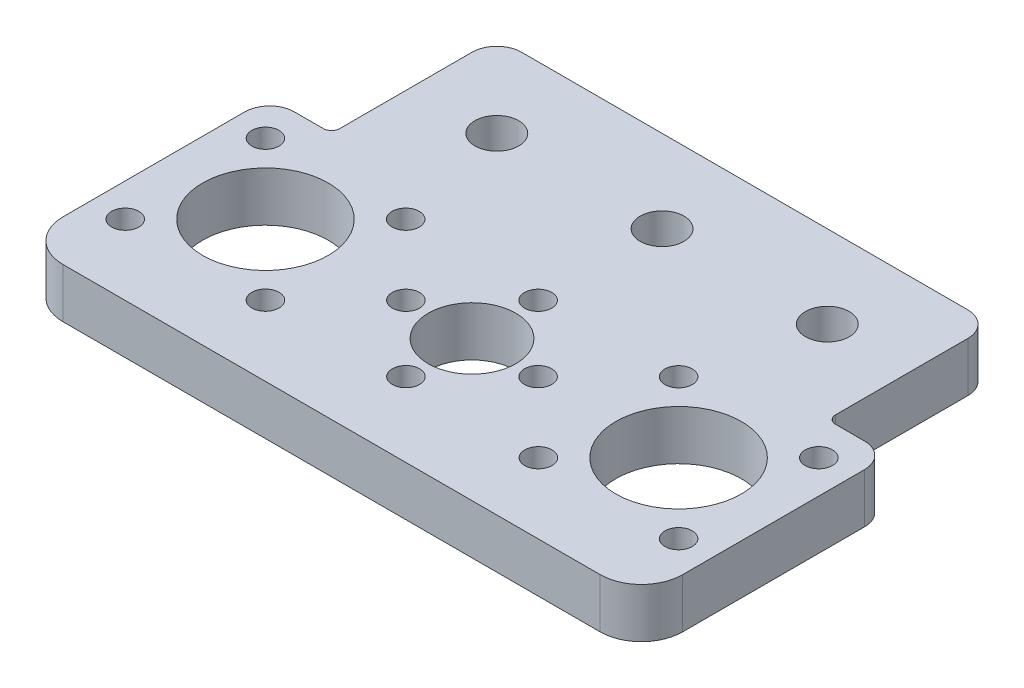
ISO-10303-21;
HEADER;
FILE_DESCRIPTION(('STEP AP214'),'2;1');
FILE_NAME('part.step','',(''),(''),'','','');
FILE_SCHEMA(('AUTOMOTIVE_DESIGN { 1 0 10303 214 1 1 1 1 }'));
ENDSEC;
DATA;
#1=APPLICATION_CONTEXT('core data for automotive mechanical design processes');
#2=APPLICATION_PROTOCOL_DEFINITION('international standard','automotive_design',2000,#1);
#3=PRODUCT_CONTEXT('',#1,'mechanical');
#4=PRODUCT('Part','Part','',(#3));
#5=PRODUCT_RELATED_PRODUCT_CATEGORY('part','',(#4));
#6=PRODUCT_DEFINITION_FORMATION('','',#4);
#7=PRODUCT_DEFINITION_CONTEXT('part definition',#1,'design');
#8=PRODUCT_DEFINITION('design','',#6,#7);
#9=PRODUCT_DEFINITION_SHAPE('','',#8);
#10=(LENGTH_UNIT() NAMED_UNIT(*) SI_UNIT(.MILLI.,.METRE.));
#11=(NAMED_UNIT(*) PLANE_ANGLE_UNIT() SI_UNIT($,.RADIAN.));
#12=(NAMED_UNIT(*) SI_UNIT($,.STERADIAN.) SOLID_ANGLE_UNIT());
#13=UNCERTAINTY_MEASURE_WITH_UNIT(LENGTH_MEASURE(1.E-05),#10,'distance_accuracy_value','');
#14=(GEOMETRIC_REPRESENTATION_CONTEXT(3) GLOBAL_UNCERTAINTY_ASSIGNED_CONTEXT((#13)) GLOBAL_UNIT_ASSIGNED_CONTEXT((#10,
#11,#12)) REPRESENTATION_CONTEXT('',''));
#15=CARTESIAN_POINT('',(0.,0.,0.));
#16=DIRECTION('',(0.,0.,1.));
#17=DIRECTION('',(1.,0.,0.));
#18=AXIS2_PLACEMENT_3D('',#15,#16,#17);
#19=CARTESIAN_POINT('',(0.,6.,17.));
#20=DIRECTION('',(0.,0.,-1.));
#21=DIRECTION('',(-1.,0.,0.));
#22=AXIS2_PLACEMENT_3D('',#19,#20,#21);
#23=PLANE('',#22);
#24=DIRECTION('',(1.,0.,0.));
#25=VECTOR('',#24,1.);
#26=CARTESIAN_POINT('',(0.,0.,17.));
#27=LINE('',#26,#25);
#28=CARTESIAN_POINT('',(-32.5,0.,17.));
#29=VERTEX_POINT('',#28);
#30=CARTESIAN_POINT('',(32.5,0.,17.));
#31=VERTEX_POINT('',#30);
#32=EDGE_CURVE('E172',#29,#31,#27,.T.);
#33=ORIENTED_EDGE('',*,*,#32,.T.);
#34=DIRECTION('',(0.,-1.,0.));
#35=VECTOR('',#34,1.);
#36=CARTESIAN_POINT('',(32.5,6.,17.));
#37=LINE('',#36,#35);
#38=CARTESIAN_POINT('',(32.5,6.,17.));
#39=VERTEX_POINT('',#38);
#40=EDGE_CURVE('E152',#39,#31,#37,.T.);
#41=ORIENTED_EDGE('',*,*,#40,.F.);
#42=DIRECTION('',(1.,0.,0.));
#43=VECTOR('',#42,1.);
#44=CARTESIAN_POINT('',(0.,6.,17.));
#45=LINE('',#44,#43);
#46=CARTESIAN_POINT('',(-32.5,6.,17.));
#47=VERTEX_POINT('',#46);
#48=EDGE_CURVE('E159',#47,#39,#45,.T.);
#49=ORIENTED_EDGE('',*,*,#48,.F.);
#50=DIRECTION('',(0.,-1.,0.));
#51=VECTOR('',#50,1.);
#52=CARTESIAN_POINT('',(-32.5,6.,17.));
#53=LINE('',#52,#51);
#54=EDGE_CURVE('E267',#47,#29,#53,.T.);
#55=ORIENTED_EDGE('',*,*,#54,.T.);
#56=EDGE_LOOP('',(#33,#41,#49,#55));
#57=FACE_BOUND('',#56,.T.);
#58=ADVANCED_FACE('F35',(#57),#23,.F.);
#59=CARTESIAN_POINT('',(32.5,6.,12.));
#60=DIRECTION('',(0.,-1.,0.));
#61=DIRECTION('',(0.,0.,-1.));
#62=AXIS2_PLACEMENT_3D('',#59,#60,#61);
#63=CYLINDRICAL_SURFACE('',#62,5.);
#64=CARTESIAN_POINT('',(32.5,0.,12.));
#65=DIRECTION('',(0.,1.,0.));
#66=DIRECTION('',(0.,0.,1.));
#67=AXIS2_PLACEMENT_3D('',#64,#65,#66);
#68=CIRCLE('',#67,5.);
#69=CARTESIAN_POINT('',(37.5,0.,12.));
#70=VERTEX_POINT('',#69);
#71=EDGE_CURVE('E276',#31,#70,#68,.T.);
#72=ORIENTED_EDGE('',*,*,#71,.T.);
#73=DIRECTION('',(0.,-1.,0.));
#74=VECTOR('',#73,1.);
#75=CARTESIAN_POINT('',(37.5,6.,12.));
#76=LINE('',#75,#74);
#77=CARTESIAN_POINT('',(37.5,6.,12.));
#78=VERTEX_POINT('',#77);
#79=EDGE_CURVE('E155',#78,#70,#76,.T.);
#80=ORIENTED_EDGE('',*,*,#79,.F.);
#81=CARTESIAN_POINT('',(32.5,6.,12.));
#82=DIRECTION('',(0.,1.,0.));
#83=DIRECTION('',(0.,0.,1.));
#84=AXIS2_PLACEMENT_3D('',#81,#82,#83);
#85=CIRCLE('',#84,5.);
#86=EDGE_CURVE('E147',#39,#78,#85,.T.);
#87=ORIENTED_EDGE('',*,*,#86,.F.);
#88=ORIENTED_EDGE('',*,*,#40,.T.);
#89=EDGE_LOOP('',(#72,#80,#87,#88));
#90=FACE_BOUND('',#89,.T.);
#91=ADVANCED_FACE('F150',(#90),#63,.T.);
#92=CARTESIAN_POINT('',(37.5,6.,0.));
#93=DIRECTION('',(1.,0.,0.));
#94=DIRECTION('',(0.,0.,-1.));
#95=AXIS2_PLACEMENT_3D('',#92,#93,#94);
#96=PLANE('',#95);
#97=DIRECTION('',(0.,0.,1.));
#98=VECTOR('',#97,1.);
#99=CARTESIAN_POINT('',(37.5,0.,0.));
#100=LINE('',#99,#98);
#101=CARTESIAN_POINT('',(37.5,0.,-10.));
#102=VERTEX_POINT('',#101);
#103=EDGE_CURVE('E279',#102,#70,#100,.T.);
#104=ORIENTED_EDGE('',*,*,#103,.F.);
#105=DIRECTION('',(0.,-1.,0.));
#106=VECTOR('',#105,1.);
#107=CARTESIAN_POINT('',(37.5,6.,-10.));
#108=LINE('',#107,#106);
#109=CARTESIAN_POINT('',(37.5,6.,-10.));
#110=VERTEX_POINT('',#109);
#111=EDGE_CURVE('E215',#102,#110,#108,.F.);
#112=ORIENTED_EDGE('',*,*,#111,.T.);
#113=DIRECTION('',(0.,0.,1.));
#114=VECTOR('',#113,1.);
#115=CARTESIAN_POINT('',(37.5,6.,0.));
#116=LINE('',#115,#114);
#117=EDGE_CURVE('E158',#110,#78,#116,.T.);
#118=ORIENTED_EDGE('',*,*,#117,.T.);
#119=ORIENTED_EDGE('',*,*,#79,.T.);
#120=EDGE_LOOP('',(#104,#112,#118,#119));
#121=FACE_BOUND('',#120,.T.);
#122=ADVANCED_FACE('F389',(#121),#96,.T.);
#123=CARTESIAN_POINT('',(0.,6.,-13.));
#124=DIRECTION('',(0.,0.,-1.));
#125=DIRECTION('',(-1.,0.,0.));
#126=AXIS2_PLACEMENT_3D('',#123,#124,#125);
#127=PLANE('',#126);
#128=DIRECTION('',(1.,0.,0.));
#129=VECTOR('',#128,1.);
#130=CARTESIAN_POINT('',(0.,0.,-13.));
#131=LINE('',#130,#129);
#132=CARTESIAN_POINT('',(31.,0.,-13.));
#133=VERTEX_POINT('',#132);
#134=CARTESIAN_POINT('',(34.5,0.,-13.));
#135=VERTEX_POINT('',#134);
#136=EDGE_CURVE('E287',#133,#135,#131,.T.);
#137=ORIENTED_EDGE('',*,*,#136,.F.);
#138=DIRECTION('',(0.,-1.,0.));
#139=VECTOR('',#138,1.);
#140=CARTESIAN_POINT('',(31.,6.,-13.));
#141=LINE('',#140,#139);
#142=CARTESIAN_POINT('',(31.,6.,-13.));
#143=VERTEX_POINT('',#142);
#144=EDGE_CURVE('E56',#133,#143,#141,.F.);
#145=ORIENTED_EDGE('',*,*,#144,.T.);
#146=DIRECTION('',(1.,0.,0.));
#147=VECTOR('',#146,1.);
#148=CARTESIAN_POINT('',(0.,6.,-13.));
#149=LINE('',#148,#147);
#150=CARTESIAN_POINT('',(34.5,6.,-13.));
#151=VERTEX_POINT('',#150);
#152=EDGE_CURVE('E309',#143,#151,#149,.T.);
#153=ORIENTED_EDGE('',*,*,#152,.T.);
#154=DIRECTION('',(0.,-1.,0.));
#155=VECTOR('',#154,1.);
#156=CARTESIAN_POINT('',(34.5,6.,-13.));
#157=LINE('',#156,#155);
#158=EDGE_CURVE('E212',#151,#135,#157,.T.);
#159=ORIENTED_EDGE('',*,*,#158,.T.);
#160=EDGE_LOOP('',(#137,#145,#153,#159));
#161=FACE_BOUND('',#160,.T.);
#162=ADVANCED_FACE('F394',(#161),#127,.T.);
#163=CARTESIAN_POINT('',(30.,6.,0.));
#164=DIRECTION('',(1.,0.,0.));
#165=DIRECTION('',(0.,0.,-1.));
#166=AXIS2_PLACEMENT_3D('',#163,#164,#165);
#167=PLANE('',#166);
#168=DIRECTION('',(0.,0.,1.));
#169=VECTOR('',#168,1.);
#170=CARTESIAN_POINT('',(30.,6.,0.));
#171=LINE('',#170,#169);
#172=CARTESIAN_POINT('',(30.,6.,-30.));
#173=VERTEX_POINT('',#172);
#174=CARTESIAN_POINT('',(30.,6.,-14.));
#175=VERTEX_POINT('',#174);
#176=EDGE_CURVE('E302',#173,#175,#171,.T.);
#177=ORIENTED_EDGE('',*,*,#176,.T.);
#178=DIRECTION('',(0.,-1.,0.));
#179=VECTOR('',#178,1.);
#180=CARTESIAN_POINT('',(30.,0.,-14.));
#181=LINE('',#180,#179);
#182=CARTESIAN_POINT('',(30.,0.,-14.));
#183=VERTEX_POINT('',#182);
#184=EDGE_CURVE('E222',#175,#183,#181,.T.);
#185=ORIENTED_EDGE('',*,*,#184,.T.);
#186=DIRECTION('',(0.,0.,1.));
#187=VECTOR('',#186,1.);
#188=CARTESIAN_POINT('',(30.,0.,0.));
#189=LINE('',#188,#187);
#190=CARTESIAN_POINT('',(30.,0.,-30.));
#191=VERTEX_POINT('',#190);
#192=EDGE_CURVE('E259',#191,#183,#189,.T.);
#193=ORIENTED_EDGE('',*,*,#192,.F.);
#194=DIRECTION('',(0.,-1.,0.));
#195=VECTOR('',#194,1.);
#196=CARTESIAN_POINT('',(30.,6.,-30.));
#197=LINE('',#196,#195);
#198=EDGE_CURVE('E192',#191,#173,#197,.F.);
#199=ORIENTED_EDGE('',*,*,#198,.T.);
#200=EDGE_LOOP('',(#177,#185,#193,#199));
#201=FACE_BOUND('',#200,.T.);
#202=ADVANCED_FACE('F292',(#201),#167,.T.);
#203=CARTESIAN_POINT('',(0.,6.,-33.));
#204=DIRECTION('',(0.,0.,-1.));
#205=DIRECTION('',(-1.,0.,0.));
#206=AXIS2_PLACEMENT_3D('',#203,#204,#205);
#207=PLANE('',#206);
#208=DIRECTION('',(1.,0.,0.));
#209=VECTOR('',#208,1.);
#210=CARTESIAN_POINT('',(0.,6.,-33.));
#211=LINE('',#210,#209);
#212=CARTESIAN_POINT('',(-27.,6.,-33.));
#213=VERTEX_POINT('',#212);
#214=CARTESIAN_POINT('',(27.,6.,-33.));
#215=VERTEX_POINT('',#214);
#216=EDGE_CURVE('E300',#213,#215,#211,.T.);
#217=ORIENTED_EDGE('',*,*,#216,.T.);
#218=DIRECTION('',(0.,-1.,0.));
#219=VECTOR('',#218,1.);
#220=CARTESIAN_POINT('',(27.,6.,-33.));
#221=LINE('',#220,#219);
#222=CARTESIAN_POINT('',(27.,0.,-33.));
#223=VERTEX_POINT('',#222);
#224=EDGE_CURVE('E175',#215,#223,#221,.T.);
#225=ORIENTED_EDGE('',*,*,#224,.T.);
#226=DIRECTION('',(1.,0.,0.));
#227=VECTOR('',#226,1.);
#228=CARTESIAN_POINT('',(0.,0.,-33.));
#229=LINE('',#228,#227);
#230=CARTESIAN_POINT('',(-27.,0.,-33.));
#231=VERTEX_POINT('',#230);
#232=EDGE_CURVE('E255',#231,#223,#229,.T.);
#233=ORIENTED_EDGE('',*,*,#232,.F.);
#234=DIRECTION('',(0.,-1.,0.));
#235=VECTOR('',#234,1.);
#236=CARTESIAN_POINT('',(-27.,6.,-33.));
#237=LINE('',#236,#235);
#238=EDGE_CURVE('E173',#231,#213,#237,.F.);
#239=ORIENTED_EDGE('',*,*,#238,.T.);
#240=EDGE_LOOP('',(#217,#225,#233,#239));
#241=FACE_BOUND('',#240,.T.);
#242=ADVANCED_FACE('F304',(#241),#207,.T.);
#243=CARTESIAN_POINT('',(-30.,6.,0.));
#244=DIRECTION('',(1.,0.,0.));
#245=DIRECTION('',(0.,0.,-1.));
#246=AXIS2_PLACEMENT_3D('',#243,#244,#245);
#247=PLANE('',#246);
#248=DIRECTION('',(0.,0.,1.));
#249=VECTOR('',#248,1.);
#250=CARTESIAN_POINT('',(-30.,0.,0.));
#251=LINE('',#250,#249);
#252=CARTESIAN_POINT('',(-30.,0.,-30.));
#253=VERTEX_POINT('',#252);
#254=CARTESIAN_POINT('',(-30.,0.,-14.));
#255=VERTEX_POINT('',#254);
#256=EDGE_CURVE('E250',#253,#255,#251,.T.);
#257=ORIENTED_EDGE('',*,*,#256,.T.);
#258=DIRECTION('',(0.,-1.,0.));
#259=VECTOR('',#258,1.);
#260=CARTESIAN_POINT('',(-30.,6.,-14.));
#261=LINE('',#260,#259);
#262=CARTESIAN_POINT('',(-30.,6.,-14.));
#263=VERTEX_POINT('',#262);
#264=EDGE_CURVE('E220',#255,#263,#261,.F.);
#265=ORIENTED_EDGE('',*,*,#264,.T.);
#266=DIRECTION('',(0.,0.,1.));
#267=VECTOR('',#266,1.);
#268=CARTESIAN_POINT('',(-30.,6.,0.));
#269=LINE('',#268,#267);
#270=CARTESIAN_POINT('',(-30.,6.,-30.));
#271=VERTEX_POINT('',#270);
#272=EDGE_CURVE('E234',#271,#263,#269,.T.);
#273=ORIENTED_EDGE('',*,*,#272,.F.);
#274=DIRECTION('',(0.,-1.,0.));
#275=VECTOR('',#274,1.);
#276=CARTESIAN_POINT('',(-30.,0.,-30.));
#277=LINE('',#276,#275);
#278=EDGE_CURVE('E203',#271,#253,#277,.T.);
#279=ORIENTED_EDGE('',*,*,#278,.T.);
#280=EDGE_LOOP('',(#257,#265,#273,#279));
#281=FACE_BOUND('',#280,.T.);
#282=ADVANCED_FACE('F253',(#281),#247,.F.);
#283=CARTESIAN_POINT('',(0.,6.,-13.));
#284=DIRECTION('',(0.,0.,1.));
#285=DIRECTION('',(1.,0.,0.));
#286=AXIS2_PLACEMENT_3D('',#283,#284,#285);
#287=PLANE('',#286);
#288=DIRECTION('',(-1.,0.,0.));
#289=VECTOR('',#288,1.);
#290=CARTESIAN_POINT('',(0.,6.,-13.));
#291=LINE('',#290,#289);
#292=CARTESIAN_POINT('',(-31.,6.,-13.));
#293=VERTEX_POINT('',#292);
#294=CARTESIAN_POINT('',(-34.5,6.,-13.));
#295=VERTEX_POINT('',#294);
#296=EDGE_CURVE('E232',#293,#295,#291,.T.);
#297=ORIENTED_EDGE('',*,*,#296,.F.);
#298=DIRECTION('',(0.,-1.,0.));
#299=VECTOR('',#298,1.);
#300=CARTESIAN_POINT('',(-31.,0.,-13.));
#301=LINE('',#300,#299);
#302=CARTESIAN_POINT('',(-31.,0.,-13.));
#303=VERTEX_POINT('',#302);
#304=EDGE_CURVE('E217',#293,#303,#301,.T.);
#305=ORIENTED_EDGE('',*,*,#304,.T.);
#306=DIRECTION('',(-1.,0.,0.));
#307=VECTOR('',#306,1.);
#308=CARTESIAN_POINT('',(0.,0.,-13.));
#309=LINE('',#308,#307);
#310=CARTESIAN_POINT('',(-34.5,0.,-13.));
#311=VERTEX_POINT('',#310);
#312=EDGE_CURVE('E251',#303,#311,#309,.T.);
#313=ORIENTED_EDGE('',*,*,#312,.T.);
#314=DIRECTION('',(0.,-1.,0.));
#315=VECTOR('',#314,1.);
#316=CARTESIAN_POINT('',(-34.5,6.,-13.));
#317=LINE('',#316,#315);
#318=EDGE_CURVE('E209',#311,#295,#317,.F.);
#319=ORIENTED_EDGE('',*,*,#318,.T.);
#320=EDGE_LOOP('',(#297,#305,#313,#319));
#321=FACE_BOUND('',#320,.T.);
#322=ADVANCED_FACE('F239',(#321),#287,.F.);
#323=CARTESIAN_POINT('',(-37.5,6.,0.));
#324=DIRECTION('',(1.,0.,0.));
#325=DIRECTION('',(0.,0.,-1.));
#326=AXIS2_PLACEMENT_3D('',#323,#324,#325);
#327=PLANE('',#326);
#328=DIRECTION('',(0.,0.,1.));
#329=VECTOR('',#328,1.);
#330=CARTESIAN_POINT('',(-37.5,6.,0.));
#331=LINE('',#330,#329);
#332=CARTESIAN_POINT('',(-37.5,6.,-10.));
#333=VERTEX_POINT('',#332);
#334=CARTESIAN_POINT('',(-37.5,6.,12.));
#335=VERTEX_POINT('',#334);
#336=EDGE_CURVE('E243',#333,#335,#331,.T.);
#337=ORIENTED_EDGE('',*,*,#336,.F.);
#338=DIRECTION('',(0.,-1.,0.));
#339=VECTOR('',#338,1.);
#340=CARTESIAN_POINT('',(-37.5,6.,-10.));
#341=LINE('',#340,#339);
#342=CARTESIAN_POINT('',(-37.5,0.,-10.));
#343=VERTEX_POINT('',#342);
#344=EDGE_CURVE('E206',#333,#343,#341,.T.);
#345=ORIENTED_EDGE('',*,*,#344,.T.);
#346=DIRECTION('',(0.,0.,1.));
#347=VECTOR('',#346,1.);
#348=CARTESIAN_POINT('',(-37.5,0.,0.));
#349=LINE('',#348,#347);
#350=CARTESIAN_POINT('',(-37.5,0.,12.));
#351=VERTEX_POINT('',#350);
#352=EDGE_CURVE('E257',#343,#351,#349,.T.);
#353=ORIENTED_EDGE('',*,*,#352,.T.);
#354=DIRECTION('',(0.,-1.,0.));
#355=VECTOR('',#354,1.);
#356=CARTESIAN_POINT('',(-37.5,6.,12.));
#357=LINE('',#356,#355);
#358=EDGE_CURVE('E177',#335,#351,#357,.T.);
#359=ORIENTED_EDGE('',*,*,#358,.F.);
#360=EDGE_LOOP('',(#337,#345,#353,#359));
#361=FACE_BOUND('',#360,.T.);
#362=ADVANCED_FACE('F380',(#361),#327,.F.);
#363=CARTESIAN_POINT('',(20.,6.,-23.));
#364=DIRECTION('',(0.,-1.,0.));
#365=DIRECTION('',(0.,0.,-1.));
#366=AXIS2_PLACEMENT_3D('',#363,#364,#365);
#367=CYLINDRICAL_SURFACE('',#366,2.65);
#368=CARTESIAN_POINT('',(20.,6.,-23.));
#369=DIRECTION('',(0.,1.,0.));
#370=DIRECTION('',(0.,0.,1.));
#371=AXIS2_PLACEMENT_3D('',#368,#369,#370);
#372=CIRCLE('',#371,2.65);
#373=CARTESIAN_POINT('',(20.,6.,-20.35));
#374=VERTEX_POINT('',#373);
#375=EDGE_CURVE('E169',#374,#374,#372,.T.);
#376=ORIENTED_EDGE('',*,*,#375,.T.);
#377=EDGE_LOOP('',(#376));
#378=FACE_BOUND('',#377,.T.);
#379=CARTESIAN_POINT('',(20.,0.,-23.));
#380=DIRECTION('',(0.,1.,0.));
#381=DIRECTION('',(0.,0.,1.));
#382=AXIS2_PLACEMENT_3D('',#379,#380,#381);
#383=CIRCLE('',#382,2.65);
#384=CARTESIAN_POINT('',(20.,0.,-20.35));
#385=VERTEX_POINT('',#384);
#386=EDGE_CURVE('E277',#385,#385,#383,.T.);
#387=ORIENTED_EDGE('',*,*,#386,.F.);
#388=EDGE_LOOP('',(#387));
#389=FACE_BOUND('',#388,.T.);
#390=ADVANCED_FACE('F370',(#378,#389),#367,.F.);
#391=CARTESIAN_POINT('',(0.,6.,-23.));
#392=DIRECTION('',(0.,-1.,0.));
#393=DIRECTION('',(0.,0.,-1.));
#394=AXIS2_PLACEMENT_3D('',#391,#392,#393);
#395=CYLINDRICAL_SURFACE('',#394,2.65);
#396=CARTESIAN_POINT('',(0.,6.,-23.));
#397=DIRECTION('',(0.,1.,0.));
#398=DIRECTION('',(0.,0.,1.));
#399=AXIS2_PLACEMENT_3D('',#396,#397,#398);
#400=CIRCLE('',#399,2.65);
#401=CARTESIAN_POINT('',(0.,6.,-20.35));
#402=VERTEX_POINT('',#401);
#403=EDGE_CURVE('E483',#402,#402,#400,.T.);
#404=ORIENTED_EDGE('',*,*,#403,.T.);
#405=EDGE_LOOP('',(#404));
#406=FACE_BOUND('',#405,.T.);
#407=CARTESIAN_POINT('',(0.,0.,-23.));
#408=DIRECTION('',(0.,1.,0.));
#409=DIRECTION('',(0.,0.,1.));
#410=AXIS2_PLACEMENT_3D('',#407,#408,#409);
#411=CIRCLE('',#410,2.65);
#412=CARTESIAN_POINT('',(0.,0.,-20.35));
#413=VERTEX_POINT('',#412);
#414=EDGE_CURVE('E282',#413,#413,#411,.T.);
#415=ORIENTED_EDGE('',*,*,#414,.F.);
#416=EDGE_LOOP('',(#415));
#417=FACE_BOUND('',#416,.T.);
#418=ADVANCED_FACE('F367',(#406,#417),#395,.F.);
#419=CARTESIAN_POINT('',(-20.,6.,-23.));
#420=DIRECTION('',(0.,-1.,0.));
#421=DIRECTION('',(0.,0.,-1.));
#422=AXIS2_PLACEMENT_3D('',#419,#420,#421);
#423=CYLINDRICAL_SURFACE('',#422,2.65);
#424=CARTESIAN_POINT('',(-20.,6.,-23.));
#425=DIRECTION('',(0.,1.,0.));
#426=DIRECTION('',(0.,0.,1.));
#427=AXIS2_PLACEMENT_3D('',#424,#425,#426);
#428=CIRCLE('',#427,2.65);
#429=CARTESIAN_POINT('',(-20.,6.,-20.35));
#430=VERTEX_POINT('',#429);
#431=EDGE_CURVE('E480',#430,#430,#428,.T.);
#432=ORIENTED_EDGE('',*,*,#431,.T.);
#433=EDGE_LOOP('',(#432));
#434=FACE_BOUND('',#433,.T.);
#435=CARTESIAN_POINT('',(-20.,0.,-23.));
#436=DIRECTION('',(0.,1.,0.));
#437=DIRECTION('',(0.,0.,1.));
#438=AXIS2_PLACEMENT_3D('',#435,#436,#437);
#439=CIRCLE('',#438,2.65);
#440=CARTESIAN_POINT('',(-20.,0.,-20.35));
#441=VERTEX_POINT('',#440);
#442=EDGE_CURVE('E360',#441,#441,#439,.T.);
#443=ORIENTED_EDGE('',*,*,#442,.F.);
#444=EDGE_LOOP('',(#443));
#445=FACE_BOUND('',#444,.T.);
#446=ADVANCED_FACE('F369',(#434,#445),#423,.F.);
#447=CARTESIAN_POINT('',(-8.,6.,0.));
#448=DIRECTION('',(0.,-1.,0.));
#449=DIRECTION('',(0.,0.,-1.));
#450=AXIS2_PLACEMENT_3D('',#447,#448,#449);
#451=CYLINDRICAL_SURFACE('',#450,1.65);
#452=CARTESIAN_POINT('',(-8.,6.,0.));
#453=DIRECTION('',(0.,1.,0.));
#454=DIRECTION('',(0.,0.,1.));
#455=AXIS2_PLACEMENT_3D('',#452,#453,#454);
#456=CIRCLE('',#455,1.65);
#457=CARTESIAN_POINT('',(-8.,6.,1.65));
#458=VERTEX_POINT('',#457);
#459=EDGE_CURVE('E476',#458,#458,#456,.T.);
#460=ORIENTED_EDGE('',*,*,#459,.T.);
#461=EDGE_LOOP('',(#460));
#462=FACE_BOUND('',#461,.T.);
#463=CARTESIAN_POINT('',(-8.,0.,0.));
#464=DIRECTION('',(0.,1.,0.));
#465=DIRECTION('',(0.,0.,1.));
#466=AXIS2_PLACEMENT_3D('',#463,#464,#465);
#467=CIRCLE('',#466,1.65);
#468=CARTESIAN_POINT('',(-8.,0.,1.65));
#469=VERTEX_POINT('',#468);
#470=EDGE_CURVE('E357',#469,#469,#467,.T.);
#471=ORIENTED_EDGE('',*,*,#470,.F.);
#472=EDGE_LOOP('',(#471));
#473=FACE_BOUND('',#472,.T.);
#474=ADVANCED_FACE('F377',(#462,#473),#451,.F.);
#475=CARTESIAN_POINT('',(0.,6.,8.));
#476=DIRECTION('',(0.,-1.,0.));
#477=DIRECTION('',(0.,0.,-1.));
#478=AXIS2_PLACEMENT_3D('',#475,#476,#477);
#479=CYLINDRICAL_SURFACE('',#478,1.65);
#480=CARTESIAN_POINT('',(0.,6.,8.));
#481=DIRECTION('',(0.,1.,0.));
#482=DIRECTION('',(0.,0.,1.));
#483=AXIS2_PLACEMENT_3D('',#480,#481,#482);
#484=CIRCLE('',#483,1.65);
#485=CARTESIAN_POINT('',(0.,6.,9.65));
#486=VERTEX_POINT('',#485);
#487=EDGE_CURVE('E472',#486,#486,#484,.T.);
#488=ORIENTED_EDGE('',*,*,#487,.T.);
#489=EDGE_LOOP('',(#488));
#490=FACE_BOUND('',#489,.T.);
#491=CARTESIAN_POINT('',(0.,0.,8.));
#492=DIRECTION('',(0.,1.,0.));
#493=DIRECTION('',(0.,0.,1.));
#494=AXIS2_PLACEMENT_3D('',#491,#492,#493);
#495=CIRCLE('',#494,1.65);
#496=CARTESIAN_POINT('',(0.,0.,9.65));
#497=VERTEX_POINT('',#496);
#498=EDGE_CURVE('E354',#497,#497,#495,.T.);
#499=ORIENTED_EDGE('',*,*,#498,.F.);
#500=EDGE_LOOP('',(#499));
#501=FACE_BOUND('',#500,.T.);
#502=ADVANCED_FACE('F568',(#490,#501),#479,.F.);
#503=CARTESIAN_POINT('',(8.,6.,0.));
#504=DIRECTION('',(0.,-1.,0.));
#505=DIRECTION('',(0.,0.,-1.));
#506=AXIS2_PLACEMENT_3D('',#503,#504,#505);
#507=CYLINDRICAL_SURFACE('',#506,1.65);
#508=CARTESIAN_POINT('',(8.,6.,0.));
#509=DIRECTION('',(0.,1.,0.));
#510=DIRECTION('',(0.,0.,1.));
#511=AXIS2_PLACEMENT_3D('',#508,#509,#510);
#512=CIRCLE('',#511,1.65);
#513=CARTESIAN_POINT('',(8.,6.,1.65));
#514=VERTEX_POINT('',#513);
#515=EDGE_CURVE('E468',#514,#514,#512,.T.);
#516=ORIENTED_EDGE('',*,*,#515,.T.);
#517=EDGE_LOOP('',(#516));
#518=FACE_BOUND('',#517,.T.);
#519=CARTESIAN_POINT('',(8.,0.,0.));
#520=DIRECTION('',(0.,1.,0.));
#521=DIRECTION('',(0.,0.,1.));
#522=AXIS2_PLACEMENT_3D('',#519,#520,#521);
#523=CIRCLE('',#522,1.65);
#524=CARTESIAN_POINT('',(8.,0.,1.65));
#525=VERTEX_POINT('',#524);
#526=EDGE_CURVE('E351',#525,#525,#523,.T.);
#527=ORIENTED_EDGE('',*,*,#526,.F.);
#528=EDGE_LOOP('',(#527));
#529=FACE_BOUND('',#528,.T.);
#530=ADVANCED_FACE('F564',(#518,#529),#507,.F.);
#531=CARTESIAN_POINT('',(0.,6.,-8.));
#532=DIRECTION('',(0.,-1.,0.));
#533=DIRECTION('',(0.,0.,-1.));
#534=AXIS2_PLACEMENT_3D('',#531,#532,#533);
#535=CYLINDRICAL_SURFACE('',#534,1.65);
#536=CARTESIAN_POINT('',(0.,6.,-8.));
#537=DIRECTION('',(0.,1.,0.));
#538=DIRECTION('',(0.,0.,1.));
#539=AXIS2_PLACEMENT_3D('',#536,#537,#538);
#540=CIRCLE('',#539,1.65);
#541=CARTESIAN_POINT('',(0.,6.,-6.35));
#542=VERTEX_POINT('',#541);
#543=EDGE_CURVE('E464',#542,#542,#540,.T.);
#544=ORIENTED_EDGE('',*,*,#543,.T.);
#545=EDGE_LOOP('',(#544));
#546=FACE_BOUND('',#545,.T.);
#547=CARTESIAN_POINT('',(0.,0.,-8.));
#548=DIRECTION('',(0.,1.,0.));
#549=DIRECTION('',(0.,0.,1.));
#550=AXIS2_PLACEMENT_3D('',#547,#548,#549);
#551=CIRCLE('',#550,1.65);
#552=CARTESIAN_POINT('',(0.,0.,-6.35));
#553=VERTEX_POINT('',#552);
#554=EDGE_CURVE('E348',#553,#553,#551,.T.);
#555=ORIENTED_EDGE('',*,*,#554,.F.);
#556=EDGE_LOOP('',(#555));
#557=FACE_BOUND('',#556,.T.);
#558=ADVANCED_FACE('F560',(#546,#557),#535,.F.);
#559=CARTESIAN_POINT('',(0.,6.,0.));
#560=DIRECTION('',(0.,-1.,0.));
#561=DIRECTION('',(0.,0.,-1.));
#562=AXIS2_PLACEMENT_3D('',#559,#560,#561);
#563=CYLINDRICAL_SURFACE('',#562,5.3);
#564=CARTESIAN_POINT('',(0.,6.,0.));
#565=DIRECTION('',(0.,1.,0.));
#566=DIRECTION('',(0.,0.,1.));
#567=AXIS2_PLACEMENT_3D('',#564,#565,#566);
#568=CIRCLE('',#567,5.3);
#569=CARTESIAN_POINT('',(0.,6.,5.3));
#570=VERTEX_POINT('',#569);
#571=EDGE_CURVE('E460',#570,#570,#568,.T.);
#572=ORIENTED_EDGE('',*,*,#571,.T.);
#573=EDGE_LOOP('',(#572));
#574=FACE_BOUND('',#573,.T.);
#575=CARTESIAN_POINT('',(0.,0.,0.));
#576=DIRECTION('',(0.,1.,0.));
#577=DIRECTION('',(0.,0.,1.));
#578=AXIS2_PLACEMENT_3D('',#575,#576,#577);
#579=CIRCLE('',#578,5.3);
#580=CARTESIAN_POINT('',(0.,0.,5.3));
#581=VERTEX_POINT('',#580);
#582=EDGE_CURVE('E345',#581,#581,#579,.T.);
#583=ORIENTED_EDGE('',*,*,#582,.F.);
#584=EDGE_LOOP('',(#583));
#585=FACE_BOUND('',#584,.T.);
#586=ADVANCED_FACE('F556',(#574,#585),#563,.F.);
#587=CARTESIAN_POINT('',(25.,6.,0.));
#588=DIRECTION('',(0.,-1.,0.));
#589=DIRECTION('',(0.,0.,-1.));
#590=AXIS2_PLACEMENT_3D('',#587,#588,#589);
#591=CYLINDRICAL_SURFACE('',#590,7.6);
#592=CARTESIAN_POINT('',(25.,6.,0.));
#593=DIRECTION('',(0.,1.,0.));
#594=DIRECTION('',(0.,0.,1.));
#595=AXIS2_PLACEMENT_3D('',#592,#593,#594);
#596=CIRCLE('',#595,7.6);
#597=CARTESIAN_POINT('',(25.,6.,7.6));
#598=VERTEX_POINT('',#597);
#599=EDGE_CURVE('E456',#598,#598,#596,.F.);
#600=ORIENTED_EDGE('',*,*,#599,.F.);
#601=EDGE_LOOP('',(#600));
#602=FACE_BOUND('',#601,.T.);
#603=CARTESIAN_POINT('',(25.,0.,0.));
#604=DIRECTION('',(0.,1.,0.));
#605=DIRECTION('',(0.,0.,1.));
#606=AXIS2_PLACEMENT_3D('',#603,#604,#605);
#607=CIRCLE('',#606,7.6);
#608=CARTESIAN_POINT('',(25.,0.,7.6));
#609=VERTEX_POINT('',#608);
#610=EDGE_CURVE('E342',#609,#609,#607,.F.);
#611=ORIENTED_EDGE('',*,*,#610,.T.);
#612=EDGE_LOOP('',(#611));
#613=FACE_BOUND('',#612,.T.);
#614=ADVANCED_FACE('F552',(#602,#613),#591,.F.);
#615=CARTESIAN_POINT('',(16.5147186257614,6.,-8.48528137423857));
#616=DIRECTION('',(0.,-1.,0.));
#617=DIRECTION('',(0.,0.,-1.));
#618=AXIS2_PLACEMENT_3D('',#615,#616,#617);
#619=CYLINDRICAL_SURFACE('',#618,1.65);
#620=CARTESIAN_POINT('',(16.5147186257614,6.,-8.48528137423857));
#621=DIRECTION('',(0.,1.,0.));
#622=DIRECTION('',(0.,0.,1.));
#623=AXIS2_PLACEMENT_3D('',#620,#621,#622);
#624=CIRCLE('',#623,1.65);
#625=CARTESIAN_POINT('',(16.5147186257614,6.,-6.83528137423857));
#626=VERTEX_POINT('',#625);
#627=EDGE_CURVE('E452',#626,#626,#624,.F.);
#628=ORIENTED_EDGE('',*,*,#627,.F.);
#629=EDGE_LOOP('',(#628));
#630=FACE_BOUND('',#629,.T.);
#631=CARTESIAN_POINT('',(16.5147186257614,0.,-8.48528137423857));
#632=DIRECTION('',(0.,1.,0.));
#633=DIRECTION('',(0.,0.,1.));
#634=AXIS2_PLACEMENT_3D('',#631,#632,#633);
#635=CIRCLE('',#634,1.65);
#636=CARTESIAN_POINT('',(16.5147186257614,0.,-6.83528137423857));
#637=VERTEX_POINT('',#636);
#638=EDGE_CURVE('E339',#637,#637,#635,.F.);
#639=ORIENTED_EDGE('',*,*,#638,.T.);
#640=EDGE_LOOP('',(#639));
#641=FACE_BOUND('',#640,.T.);
#642=ADVANCED_FACE('F548',(#630,#641),#619,.F.);
#643=CARTESIAN_POINT('',(-25.,6.,0.));
#644=DIRECTION('',(0.,-1.,0.));
#645=DIRECTION('',(0.,0.,-1.));
#646=AXIS2_PLACEMENT_3D('',#643,#644,#645);
#647=CYLINDRICAL_SURFACE('',#646,7.6);
#648=CARTESIAN_POINT('',(-25.,6.,0.));
#649=DIRECTION('',(0.,1.,0.));
#650=DIRECTION('',(0.,0.,1.));
#651=AXIS2_PLACEMENT_3D('',#648,#649,#650);
#652=CIRCLE('',#651,7.6);
#653=CARTESIAN_POINT('',(-25.,6.,7.6));
#654=VERTEX_POINT('',#653);
#655=EDGE_CURVE('E448',#654,#654,#652,.T.);
#656=ORIENTED_EDGE('',*,*,#655,.T.);
#657=EDGE_LOOP('',(#656));
#658=FACE_BOUND('',#657,.T.);
#659=CARTESIAN_POINT('',(-25.,0.,0.));
#660=DIRECTION('',(0.,1.,0.));
#661=DIRECTION('',(0.,0.,1.));
#662=AXIS2_PLACEMENT_3D('',#659,#660,#661);
#663=CIRCLE('',#662,7.6);
#664=CARTESIAN_POINT('',(-25.,0.,7.6));
#665=VERTEX_POINT('',#664);
#666=EDGE_CURVE('E336',#665,#665,#663,.T.);
#667=ORIENTED_EDGE('',*,*,#666,.F.);
#668=EDGE_LOOP('',(#667));
#669=FACE_BOUND('',#668,.T.);
#670=ADVANCED_FACE('F544',(#658,#669),#647,.F.);
#671=CARTESIAN_POINT('',(-33.4852813742386,6.,-8.48528137423857));
#672=DIRECTION('',(0.,-1.,0.));
#673=DIRECTION('',(0.,0.,-1.));
#674=AXIS2_PLACEMENT_3D('',#671,#672,#673);
#675=CYLINDRICAL_SURFACE('',#674,1.65);
#676=CARTESIAN_POINT('',(-33.4852813742386,6.,-8.48528137423857));
#677=DIRECTION('',(0.,1.,0.));
#678=DIRECTION('',(0.,0.,1.));
#679=AXIS2_PLACEMENT_3D('',#676,#677,#678);
#680=CIRCLE('',#679,1.65);
#681=CARTESIAN_POINT('',(-33.4852813742386,6.,-6.83528137423857));
#682=VERTEX_POINT('',#681);
#683=EDGE_CURVE('E444',#682,#682,#680,.T.);
#684=ORIENTED_EDGE('',*,*,#683,.T.);
#685=EDGE_LOOP('',(#684));
#686=FACE_BOUND('',#685,.T.);
#687=CARTESIAN_POINT('',(-33.4852813742386,0.,-8.48528137423857));
#688=DIRECTION('',(0.,1.,0.));
#689=DIRECTION('',(0.,0.,1.));
#690=AXIS2_PLACEMENT_3D('',#687,#688,#689);
#691=CIRCLE('',#690,1.65);
#692=CARTESIAN_POINT('',(-33.4852813742386,0.,-6.83528137423857));
#693=VERTEX_POINT('',#692);
#694=EDGE_CURVE('E333',#693,#693,#691,.T.);
#695=ORIENTED_EDGE('',*,*,#694,.F.);
#696=EDGE_LOOP('',(#695));
#697=FACE_BOUND('',#696,.T.);
#698=ADVANCED_FACE('F540',(#686,#697),#675,.F.);
#699=CARTESIAN_POINT('',(-16.5147186257614,6.,-8.48528137423857));
#700=DIRECTION('',(0.,-1.,0.));
#701=DIRECTION('',(0.,0.,-1.));
#702=AXIS2_PLACEMENT_3D('',#699,#700,#701);
#703=CYLINDRICAL_SURFACE('',#702,1.65);
#704=CARTESIAN_POINT('',(-16.5147186257614,6.,-8.48528137423857));
#705=DIRECTION('',(0.,1.,0.));
#706=DIRECTION('',(0.,0.,1.));
#707=AXIS2_PLACEMENT_3D('',#704,#705,#706);
#708=CIRCLE('',#707,1.65);
#709=CARTESIAN_POINT('',(-16.5147186257614,6.,-6.83528137423857));
#710=VERTEX_POINT('',#709);
#711=EDGE_CURVE('E440',#710,#710,#708,.T.);
#712=ORIENTED_EDGE('',*,*,#711,.T.);
#713=EDGE_LOOP('',(#712));
#714=FACE_BOUND('',#713,.T.);
#715=CARTESIAN_POINT('',(-16.5147186257614,0.,-8.48528137423857));
#716=DIRECTION('',(0.,1.,0.));
#717=DIRECTION('',(0.,0.,1.));
#718=AXIS2_PLACEMENT_3D('',#715,#716,#717);
#719=CIRCLE('',#718,1.65);
#720=CARTESIAN_POINT('',(-16.5147186257614,0.,-6.83528137423857));
#721=VERTEX_POINT('',#720);
#722=EDGE_CURVE('E330',#721,#721,#719,.T.);
#723=ORIENTED_EDGE('',*,*,#722,.F.);
#724=EDGE_LOOP('',(#723));
#725=FACE_BOUND('',#724,.T.);
#726=ADVANCED_FACE('F536',(#714,#725),#703,.F.);
#727=CARTESIAN_POINT('',(-16.5147186257614,6.,8.48528137423857));
#728=DIRECTION('',(0.,-1.,0.));
#729=DIRECTION('',(0.,0.,-1.));
#730=AXIS2_PLACEMENT_3D('',#727,#728,#729);
#731=CYLINDRICAL_SURFACE('',#730,1.65000000000001);
#732=CARTESIAN_POINT('',(-16.5147186257614,6.,8.48528137423857));
#733=DIRECTION('',(0.,1.,0.));
#734=DIRECTION('',(0.,0.,1.));
#735=AXIS2_PLACEMENT_3D('',#732,#733,#734);
#736=CIRCLE('',#735,1.65000000000001);
#737=CARTESIAN_POINT('',(-16.5147186257614,6.,10.1352813742386));
#738=VERTEX_POINT('',#737);
#739=EDGE_CURVE('E436',#738,#738,#736,.T.);
#740=ORIENTED_EDGE('',*,*,#739,.T.);
#741=EDGE_LOOP('',(#740));
#742=FACE_BOUND('',#741,.T.);
#743=CARTESIAN_POINT('',(-16.5147186257614,0.,8.48528137423857));
#744=DIRECTION('',(0.,1.,0.));
#745=DIRECTION('',(0.,0.,1.));
#746=AXIS2_PLACEMENT_3D('',#743,#744,#745);
#747=CIRCLE('',#746,1.65000000000001);
#748=CARTESIAN_POINT('',(-16.5147186257614,0.,10.1352813742386));
#749=VERTEX_POINT('',#748);
#750=EDGE_CURVE('E327',#749,#749,#747,.T.);
#751=ORIENTED_EDGE('',*,*,#750,.F.);
#752=EDGE_LOOP('',(#751));
#753=FACE_BOUND('',#752,.T.);
#754=ADVANCED_FACE('F532',(#742,#753),#731,.F.);
#755=CARTESIAN_POINT('',(-33.4852813742386,6.,8.48528137423857));
#756=DIRECTION('',(0.,-1.,0.));
#757=DIRECTION('',(0.,0.,-1.));
#758=AXIS2_PLACEMENT_3D('',#755,#756,#757);
#759=CYLINDRICAL_SURFACE('',#758,1.65);
#760=CARTESIAN_POINT('',(-33.4852813742386,6.,8.48528137423857));
#761=DIRECTION('',(0.,1.,0.));
#762=DIRECTION('',(0.,0.,1.));
#763=AXIS2_PLACEMENT_3D('',#760,#761,#762);
#764=CIRCLE('',#763,1.65);
#765=CARTESIAN_POINT('',(-33.4852813742386,6.,10.1352813742386));
#766=VERTEX_POINT('',#765);
#767=EDGE_CURVE('E432',#766,#766,#764,.T.);
#768=ORIENTED_EDGE('',*,*,#767,.T.);
#769=EDGE_LOOP('',(#768));
#770=FACE_BOUND('',#769,.T.);
#771=CARTESIAN_POINT('',(-33.4852813742386,0.,8.48528137423857));
#772=DIRECTION('',(0.,1.,0.));
#773=DIRECTION('',(0.,0.,1.));
#774=AXIS2_PLACEMENT_3D('',#771,#772,#773);
#775=CIRCLE('',#774,1.65);
#776=CARTESIAN_POINT('',(-33.4852813742386,0.,10.1352813742386));
#777=VERTEX_POINT('',#776);
#778=EDGE_CURVE('E324',#777,#777,#775,.T.);
#779=ORIENTED_EDGE('',*,*,#778,.F.);
#780=EDGE_LOOP('',(#779));
#781=FACE_BOUND('',#780,.T.);
#782=ADVANCED_FACE('F528',(#770,#781),#759,.F.);
#783=CARTESIAN_POINT('',(16.5147186257614,6.,8.48528137423857));
#784=DIRECTION('',(0.,-1.,0.));
#785=DIRECTION('',(0.,0.,-1.));
#786=AXIS2_PLACEMENT_3D('',#783,#784,#785);
#787=CYLINDRICAL_SURFACE('',#786,1.65000000000001);
#788=CARTESIAN_POINT('',(16.5147186257614,6.,8.48528137423857));
#789=DIRECTION('',(0.,1.,0.));
#790=DIRECTION('',(0.,0.,1.));
#791=AXIS2_PLACEMENT_3D('',#788,#789,#790);
#792=CIRCLE('',#791,1.65000000000001);
#793=CARTESIAN_POINT('',(16.5147186257614,6.,10.1352813742386));
#794=VERTEX_POINT('',#793);
#795=EDGE_CURVE('E428',#794,#794,#792,.F.);
#796=ORIENTED_EDGE('',*,*,#795,.F.);
#797=EDGE_LOOP('',(#796));
#798=FACE_BOUND('',#797,.T.);
#799=CARTESIAN_POINT('',(16.5147186257614,0.,8.48528137423857));
#800=DIRECTION('',(0.,1.,0.));
#801=DIRECTION('',(0.,0.,1.));
#802=AXIS2_PLACEMENT_3D('',#799,#800,#801);
#803=CIRCLE('',#802,1.65000000000001);
#804=CARTESIAN_POINT('',(16.5147186257614,0.,10.1352813742386));
#805=VERTEX_POINT('',#804);
#806=EDGE_CURVE('E321',#805,#805,#803,.F.);
#807=ORIENTED_EDGE('',*,*,#806,.T.);
#808=EDGE_LOOP('',(#807));
#809=FACE_BOUND('',#808,.T.);
#810=ADVANCED_FACE('F524',(#798,#809),#787,.F.);
#811=CARTESIAN_POINT('',(33.4852813742386,6.,-8.48528137423857));
#812=DIRECTION('',(0.,-1.,0.));
#813=DIRECTION('',(0.,0.,-1.));
#814=AXIS2_PLACEMENT_3D('',#811,#812,#813);
#815=CYLINDRICAL_SURFACE('',#814,1.65);
#816=CARTESIAN_POINT('',(33.4852813742386,6.,-8.48528137423857));
#817=DIRECTION('',(0.,1.,0.));
#818=DIRECTION('',(0.,0.,1.));
#819=AXIS2_PLACEMENT_3D('',#816,#817,#818);
#820=CIRCLE('',#819,1.65);
#821=CARTESIAN_POINT('',(33.4852813742386,6.,-6.83528137423857));
#822=VERTEX_POINT('',#821);
#823=EDGE_CURVE('E424',#822,#822,#820,.F.);
#824=ORIENTED_EDGE('',*,*,#823,.F.);
#825=EDGE_LOOP('',(#824));
#826=FACE_BOUND('',#825,.T.);
#827=CARTESIAN_POINT('',(33.4852813742386,0.,-8.48528137423857));
#828=DIRECTION('',(0.,1.,0.));
#829=DIRECTION('',(0.,0.,1.));
#830=AXIS2_PLACEMENT_3D('',#827,#828,#829);
#831=CIRCLE('',#830,1.65);
#832=CARTESIAN_POINT('',(33.4852813742386,0.,-6.83528137423857));
#833=VERTEX_POINT('',#832);
#834=EDGE_CURVE('E318',#833,#833,#831,.F.);
#835=ORIENTED_EDGE('',*,*,#834,.T.);
#836=EDGE_LOOP('',(#835));
#837=FACE_BOUND('',#836,.T.);
#838=ADVANCED_FACE('F520',(#826,#837),#815,.F.);
#839=CARTESIAN_POINT('',(33.4852813742386,6.,8.48528137423857));
#840=DIRECTION('',(0.,-1.,0.));
#841=DIRECTION('',(0.,0.,-1.));
#842=AXIS2_PLACEMENT_3D('',#839,#840,#841);
#843=CYLINDRICAL_SURFACE('',#842,1.65);
#844=CARTESIAN_POINT('',(33.4852813742386,6.,8.48528137423857));
#845=DIRECTION('',(0.,1.,0.));
#846=DIRECTION('',(0.,0.,1.));
#847=AXIS2_PLACEMENT_3D('',#844,#845,#846);
#848=CIRCLE('',#847,1.65);
#849=CARTESIAN_POINT('',(33.4852813742386,6.,10.1352813742386));
#850=VERTEX_POINT('',#849);
#851=EDGE_CURVE('E266',#850,#850,#848,.F.);
#852=ORIENTED_EDGE('',*,*,#851,.F.);
#853=EDGE_LOOP('',(#852));
#854=FACE_BOUND('',#853,.T.);
#855=CARTESIAN_POINT('',(33.4852813742386,0.,8.48528137423857));
#856=DIRECTION('',(0.,1.,0.));
#857=DIRECTION('',(0.,0.,1.));
#858=AXIS2_PLACEMENT_3D('',#855,#856,#857);
#859=CIRCLE('',#858,1.65);
#860=CARTESIAN_POINT('',(33.4852813742386,0.,10.1352813742386));
#861=VERTEX_POINT('',#860);
#862=EDGE_CURVE('E315',#861,#861,#859,.F.);
#863=ORIENTED_EDGE('',*,*,#862,.T.);
#864=EDGE_LOOP('',(#863));
#865=FACE_BOUND('',#864,.T.);
#866=ADVANCED_FACE('F410',(#854,#865),#843,.F.);
#867=CARTESIAN_POINT('',(-32.5,6.,12.));
#868=DIRECTION('',(0.,-1.,0.));
#869=DIRECTION('',(0.,0.,-1.));
#870=AXIS2_PLACEMENT_3D('',#867,#868,#869);
#871=CYLINDRICAL_SURFACE('',#870,5.);
#872=CARTESIAN_POINT('',(-32.5,0.,12.));
#873=DIRECTION('',(0.,1.,0.));
#874=DIRECTION('',(0.,0.,1.));
#875=AXIS2_PLACEMENT_3D('',#872,#873,#874);
#876=CIRCLE('',#875,5.);
#877=EDGE_CURVE('E264',#351,#29,#876,.T.);
#878=ORIENTED_EDGE('',*,*,#877,.T.);
#879=ORIENTED_EDGE('',*,*,#54,.F.);
#880=CARTESIAN_POINT('',(-32.5,6.,12.));
#881=DIRECTION('',(0.,1.,0.));
#882=DIRECTION('',(0.,0.,1.));
#883=AXIS2_PLACEMENT_3D('',#880,#881,#882);
#884=CIRCLE('',#883,5.);
#885=EDGE_CURVE('E165',#335,#47,#884,.T.);
#886=ORIENTED_EDGE('',*,*,#885,.F.);
#887=ORIENTED_EDGE('',*,*,#358,.T.);
#888=EDGE_LOOP('',(#878,#879,#886,#887));
#889=FACE_BOUND('',#888,.T.);
#890=ADVANCED_FACE('F272',(#889),#871,.T.);
#891=CARTESIAN_POINT('',(0.,6.,0.));
#892=DIRECTION('',(0.,1.,0.));
#893=DIRECTION('',(0.,0.,1.));
#894=AXIS2_PLACEMENT_3D('',#891,#892,#893);
#895=PLANE('',#894);
#896=ORIENTED_EDGE('',*,*,#851,.T.);
#897=EDGE_LOOP('',(#896));
#898=FACE_BOUND('',#897,.T.);
#899=ORIENTED_EDGE('',*,*,#823,.T.);
#900=EDGE_LOOP('',(#899));
#901=FACE_BOUND('',#900,.T.);
#902=ORIENTED_EDGE('',*,*,#795,.T.);
#903=EDGE_LOOP('',(#902));
#904=FACE_BOUND('',#903,.T.);
#905=ORIENTED_EDGE('',*,*,#767,.F.);
#906=EDGE_LOOP('',(#905));
#907=FACE_BOUND('',#906,.T.);
#908=ORIENTED_EDGE('',*,*,#739,.F.);
#909=EDGE_LOOP('',(#908));
#910=FACE_BOUND('',#909,.T.);
#911=ORIENTED_EDGE('',*,*,#711,.F.);
#912=EDGE_LOOP('',(#911));
#913=FACE_BOUND('',#912,.T.);
#914=ORIENTED_EDGE('',*,*,#683,.F.);
#915=EDGE_LOOP('',(#914));
#916=FACE_BOUND('',#915,.T.);
#917=ORIENTED_EDGE('',*,*,#655,.F.);
#918=EDGE_LOOP('',(#917));
#919=FACE_BOUND('',#918,.T.);
#920=ORIENTED_EDGE('',*,*,#627,.T.);
#921=EDGE_LOOP('',(#920));
#922=FACE_BOUND('',#921,.T.);
#923=ORIENTED_EDGE('',*,*,#599,.T.);
#924=EDGE_LOOP('',(#923));
#925=FACE_BOUND('',#924,.T.);
#926=ORIENTED_EDGE('',*,*,#571,.F.);
#927=EDGE_LOOP('',(#926));
#928=FACE_BOUND('',#927,.T.);
#929=ORIENTED_EDGE('',*,*,#543,.F.);
#930=EDGE_LOOP('',(#929));
#931=FACE_BOUND('',#930,.T.);
#932=ORIENTED_EDGE('',*,*,#515,.F.);
#933=EDGE_LOOP('',(#932));
#934=FACE_BOUND('',#933,.T.);
#935=ORIENTED_EDGE('',*,*,#487,.F.);
#936=EDGE_LOOP('',(#935));
#937=FACE_BOUND('',#936,.T.);
#938=ORIENTED_EDGE('',*,*,#459,.F.);
#939=EDGE_LOOP('',(#938));
#940=FACE_BOUND('',#939,.T.);
#941=ORIENTED_EDGE('',*,*,#431,.F.);
#942=EDGE_LOOP('',(#941));
#943=FACE_BOUND('',#942,.T.);
#944=ORIENTED_EDGE('',*,*,#403,.F.);
#945=EDGE_LOOP('',(#944));
#946=FACE_BOUND('',#945,.T.);
#947=ORIENTED_EDGE('',*,*,#375,.F.);
#948=EDGE_LOOP('',(#947));
#949=FACE_BOUND('',#948,.T.);
#950=ORIENTED_EDGE('',*,*,#176,.F.);
#951=CARTESIAN_POINT('',(27.,6.,-30.));
#952=DIRECTION('',(0.,1.,0.));
#953=DIRECTION('',(0.,0.,1.));
#954=AXIS2_PLACEMENT_3D('',#951,#952,#953);
#955=CIRCLE('',#954,3.);
#956=EDGE_CURVE('E201',#173,#215,#955,.T.);
#957=ORIENTED_EDGE('',*,*,#956,.T.);
#958=ORIENTED_EDGE('',*,*,#216,.F.);
#959=CARTESIAN_POINT('',(-27.,6.,-30.));
#960=DIRECTION('',(0.,1.,0.));
#961=DIRECTION('',(0.,0.,1.));
#962=AXIS2_PLACEMENT_3D('',#959,#960,#961);
#963=CIRCLE('',#962,3.);
#964=EDGE_CURVE('E199',#213,#271,#963,.T.);
#965=ORIENTED_EDGE('',*,*,#964,.T.);
#966=ORIENTED_EDGE('',*,*,#272,.T.);
#967=CARTESIAN_POINT('',(-31.,6.,-14.));
#968=DIRECTION('',(0.,1.,0.));
#969=DIRECTION('',(0.,0.,1.));
#970=AXIS2_PLACEMENT_3D('',#967,#968,#969);
#971=CIRCLE('',#970,1.);
#972=EDGE_CURVE('E228',#263,#293,#971,.F.);
#973=ORIENTED_EDGE('',*,*,#972,.T.);
#974=ORIENTED_EDGE('',*,*,#296,.T.);
#975=CARTESIAN_POINT('',(-34.5,6.,-10.));
#976=DIRECTION('',(0.,1.,0.));
#977=DIRECTION('',(0.,0.,1.));
#978=AXIS2_PLACEMENT_3D('',#975,#976,#977);
#979=CIRCLE('',#978,3.);
#980=EDGE_CURVE('E197',#295,#333,#979,.T.);
#981=ORIENTED_EDGE('',*,*,#980,.T.);
#982=ORIENTED_EDGE('',*,*,#336,.T.);
#983=ORIENTED_EDGE('',*,*,#885,.T.);
#984=ORIENTED_EDGE('',*,*,#48,.T.);
#985=ORIENTED_EDGE('',*,*,#86,.T.);
#986=ORIENTED_EDGE('',*,*,#117,.F.);
#987=CARTESIAN_POINT('',(34.5,6.,-10.));
#988=DIRECTION('',(0.,1.,0.));
#989=DIRECTION('',(0.,0.,1.));
#990=AXIS2_PLACEMENT_3D('',#987,#988,#989);
#991=CIRCLE('',#990,3.);
#992=EDGE_CURVE('E194',#110,#151,#991,.T.);
#993=ORIENTED_EDGE('',*,*,#992,.T.);
#994=ORIENTED_EDGE('',*,*,#152,.F.);
#995=CARTESIAN_POINT('',(31.,6.,-14.));
#996=DIRECTION('',(0.,1.,0.));
#997=DIRECTION('',(0.,0.,1.));
#998=AXIS2_PLACEMENT_3D('',#995,#996,#997);
#999=CIRCLE('',#998,1.);
#1000=EDGE_CURVE('E11',#143,#175,#999,.F.);
#1001=ORIENTED_EDGE('',*,*,#1000,.T.);
#1002=EDGE_LOOP('',(#950,#957,#958,#965,#966,#973,#974,#981,#982,#983,#984,#985,#986,#993,#994,#1001));
#1003=FACE_BOUND('',#1002,.T.);
#1004=ADVANCED_FACE('F163',(#898,#901,#904,#907,#910,#913,#916,#919,#922,#925,#928,#931,#934,
#937,#940,#943,#946,#949,#1003),#895,.T.);
#1005=CARTESIAN_POINT('',(0.,0.,0.));
#1006=DIRECTION('',(0.,1.,0.));
#1007=DIRECTION('',(0.,0.,1.));
#1008=AXIS2_PLACEMENT_3D('',#1005,#1006,#1007);
#1009=PLANE('',#1008);
#1010=ORIENTED_EDGE('',*,*,#862,.F.);
#1011=EDGE_LOOP('',(#1010));
#1012=FACE_BOUND('',#1011,.T.);
#1013=ORIENTED_EDGE('',*,*,#834,.F.);
#1014=EDGE_LOOP('',(#1013));
#1015=FACE_BOUND('',#1014,.T.);
#1016=ORIENTED_EDGE('',*,*,#806,.F.);
#1017=EDGE_LOOP('',(#1016));
#1018=FACE_BOUND('',#1017,.T.);
#1019=ORIENTED_EDGE('',*,*,#778,.T.);
#1020=EDGE_LOOP('',(#1019));
#1021=FACE_BOUND('',#1020,.T.);
#1022=ORIENTED_EDGE('',*,*,#750,.T.);
#1023=EDGE_LOOP('',(#1022));
#1024=FACE_BOUND('',#1023,.T.);
#1025=ORIENTED_EDGE('',*,*,#722,.T.);
#1026=EDGE_LOOP('',(#1025));
#1027=FACE_BOUND('',#1026,.T.);
#1028=ORIENTED_EDGE('',*,*,#694,.T.);
#1029=EDGE_LOOP('',(#1028));
#1030=FACE_BOUND('',#1029,.T.);
#1031=ORIENTED_EDGE('',*,*,#666,.T.);
#1032=EDGE_LOOP('',(#1031));
#1033=FACE_BOUND('',#1032,.T.);
#1034=ORIENTED_EDGE('',*,*,#638,.F.);
#1035=EDGE_LOOP('',(#1034));
#1036=FACE_BOUND('',#1035,.T.);
#1037=ORIENTED_EDGE('',*,*,#610,.F.);
#1038=EDGE_LOOP('',(#1037));
#1039=FACE_BOUND('',#1038,.T.);
#1040=ORIENTED_EDGE('',*,*,#582,.T.);
#1041=EDGE_LOOP('',(#1040));
#1042=FACE_BOUND('',#1041,.T.);
#1043=ORIENTED_EDGE('',*,*,#554,.T.);
#1044=EDGE_LOOP('',(#1043));
#1045=FACE_BOUND('',#1044,.T.);
#1046=ORIENTED_EDGE('',*,*,#526,.T.);
#1047=EDGE_LOOP('',(#1046));
#1048=FACE_BOUND('',#1047,.T.);
#1049=ORIENTED_EDGE('',*,*,#498,.T.);
#1050=EDGE_LOOP('',(#1049));
#1051=FACE_BOUND('',#1050,.T.);
#1052=ORIENTED_EDGE('',*,*,#470,.T.);
#1053=EDGE_LOOP('',(#1052));
#1054=FACE_BOUND('',#1053,.T.);
#1055=ORIENTED_EDGE('',*,*,#442,.T.);
#1056=EDGE_LOOP('',(#1055));
#1057=FACE_BOUND('',#1056,.T.);
#1058=ORIENTED_EDGE('',*,*,#414,.T.);
#1059=EDGE_LOOP('',(#1058));
#1060=FACE_BOUND('',#1059,.T.);
#1061=ORIENTED_EDGE('',*,*,#386,.T.);
#1062=EDGE_LOOP('',(#1061));
#1063=FACE_BOUND('',#1062,.T.);
#1064=ORIENTED_EDGE('',*,*,#232,.T.);
#1065=CARTESIAN_POINT('',(27.,0.,-30.));
#1066=DIRECTION('',(0.,1.,0.));
#1067=DIRECTION('',(0.,0.,1.));
#1068=AXIS2_PLACEMENT_3D('',#1065,#1066,#1067);
#1069=CIRCLE('',#1068,3.);
#1070=EDGE_CURVE('E190',#223,#191,#1069,.F.);
#1071=ORIENTED_EDGE('',*,*,#1070,.T.);
#1072=ORIENTED_EDGE('',*,*,#192,.T.);
#1073=CARTESIAN_POINT('',(31.,0.,-14.));
#1074=DIRECTION('',(0.,1.,0.));
#1075=DIRECTION('',(0.,0.,1.));
#1076=AXIS2_PLACEMENT_3D('',#1073,#1074,#1075);
#1077=CIRCLE('',#1076,1.);
#1078=EDGE_CURVE('E43',#183,#133,#1077,.T.);
#1079=ORIENTED_EDGE('',*,*,#1078,.T.);
#1080=ORIENTED_EDGE('',*,*,#136,.T.);
#1081=CARTESIAN_POINT('',(34.5,0.,-10.));
#1082=DIRECTION('',(0.,1.,0.));
#1083=DIRECTION('',(0.,0.,1.));
#1084=AXIS2_PLACEMENT_3D('',#1081,#1082,#1083);
#1085=CIRCLE('',#1084,3.);
#1086=EDGE_CURVE('E183',#135,#102,#1085,.F.);
#1087=ORIENTED_EDGE('',*,*,#1086,.T.);
#1088=ORIENTED_EDGE('',*,*,#103,.T.);
#1089=ORIENTED_EDGE('',*,*,#71,.F.);
#1090=ORIENTED_EDGE('',*,*,#32,.F.);
#1091=ORIENTED_EDGE('',*,*,#877,.F.);
#1092=ORIENTED_EDGE('',*,*,#352,.F.);
#1093=CARTESIAN_POINT('',(-34.5,0.,-10.));
#1094=DIRECTION('',(0.,1.,0.));
#1095=DIRECTION('',(0.,0.,1.));
#1096=AXIS2_PLACEMENT_3D('',#1093,#1094,#1095);
#1097=CIRCLE('',#1096,3.);
#1098=EDGE_CURVE('E185',#343,#311,#1097,.F.);
#1099=ORIENTED_EDGE('',*,*,#1098,.T.);
#1100=ORIENTED_EDGE('',*,*,#312,.F.);
#1101=CARTESIAN_POINT('',(-31.,0.,-14.));
#1102=DIRECTION('',(0.,1.,0.));
#1103=DIRECTION('',(0.,0.,1.));
#1104=AXIS2_PLACEMENT_3D('',#1101,#1102,#1103);
#1105=CIRCLE('',#1104,1.);
#1106=EDGE_CURVE('E226',#303,#255,#1105,.T.);
#1107=ORIENTED_EDGE('',*,*,#1106,.T.);
#1108=ORIENTED_EDGE('',*,*,#256,.F.);
#1109=CARTESIAN_POINT('',(-27.,0.,-30.));
#1110=DIRECTION('',(0.,1.,0.));
#1111=DIRECTION('',(0.,0.,1.));
#1112=AXIS2_PLACEMENT_3D('',#1109,#1110,#1111);
#1113=CIRCLE('',#1112,3.);
#1114=EDGE_CURVE('E188',#253,#231,#1113,.F.);
#1115=ORIENTED_EDGE('',*,*,#1114,.T.);
#1116=EDGE_LOOP('',(#1064,#1071,#1072,#1079,#1080,#1087,#1088,#1089,#1090,#1091,#1092,#1099,
#1100,#1107,#1108,#1115));
#1117=FACE_BOUND('',#1116,.T.);
#1118=ADVANCED_FACE('F249',(#1012,#1015,#1018,#1021,#1024,#1027,#1030,#1033,#1036,#1039,#1042,
#1045,#1048,#1051,#1054,#1057,#1060,#1063,#1117),#1009,.F.);
#1119=CARTESIAN_POINT('',(27.,6.,-30.));
#1120=DIRECTION('',(0.,-1.,0.));
#1121=DIRECTION('',(0.,0.,-1.));
#1122=AXIS2_PLACEMENT_3D('',#1119,#1120,#1121);
#1123=CYLINDRICAL_SURFACE('',#1122,3.);
#1124=ORIENTED_EDGE('',*,*,#956,.F.);
#1125=ORIENTED_EDGE('',*,*,#198,.F.);
#1126=ORIENTED_EDGE('',*,*,#1070,.F.);
#1127=ORIENTED_EDGE('',*,*,#224,.F.);
#1128=EDGE_LOOP('',(#1124,#1125,#1126,#1127));
#1129=FACE_BOUND('',#1128,.T.);
#1130=ADVANCED_FACE('F296',(#1129),#1123,.T.);
#1131=CARTESIAN_POINT('',(-27.,6.,-30.));
#1132=DIRECTION('',(0.,1.,0.));
#1133=DIRECTION('',(0.,0.,1.));
#1134=AXIS2_PLACEMENT_3D('',#1131,#1132,#1133);
#1135=CYLINDRICAL_SURFACE('',#1134,3.);
#1136=ORIENTED_EDGE('',*,*,#964,.F.);
#1137=ORIENTED_EDGE('',*,*,#238,.F.);
#1138=ORIENTED_EDGE('',*,*,#1114,.F.);
#1139=ORIENTED_EDGE('',*,*,#278,.F.);
#1140=EDGE_LOOP('',(#1136,#1137,#1138,#1139));
#1141=FACE_BOUND('',#1140,.T.);
#1142=ADVANCED_FACE('F511',(#1141),#1135,.T.);
#1143=CARTESIAN_POINT('',(-34.5,6.,-10.));
#1144=DIRECTION('',(0.,-1.,0.));
#1145=DIRECTION('',(0.,0.,-1.));
#1146=AXIS2_PLACEMENT_3D('',#1143,#1144,#1145);
#1147=CYLINDRICAL_SURFACE('',#1146,3.);
#1148=ORIENTED_EDGE('',*,*,#980,.F.);
#1149=ORIENTED_EDGE('',*,*,#318,.F.);
#1150=ORIENTED_EDGE('',*,*,#1098,.F.);
#1151=ORIENTED_EDGE('',*,*,#344,.F.);
#1152=EDGE_LOOP('',(#1148,#1149,#1150,#1151));
#1153=FACE_BOUND('',#1152,.T.);
#1154=ADVANCED_FACE('F506',(#1153),#1147,.T.);
#1155=CARTESIAN_POINT('',(34.5,6.,-10.));
#1156=DIRECTION('',(0.,-1.,0.));
#1157=DIRECTION('',(0.,0.,-1.));
#1158=AXIS2_PLACEMENT_3D('',#1155,#1156,#1157);
#1159=CYLINDRICAL_SURFACE('',#1158,3.);
#1160=ORIENTED_EDGE('',*,*,#992,.F.);
#1161=ORIENTED_EDGE('',*,*,#111,.F.);
#1162=ORIENTED_EDGE('',*,*,#1086,.F.);
#1163=ORIENTED_EDGE('',*,*,#158,.F.);
#1164=EDGE_LOOP('',(#1160,#1161,#1162,#1163));
#1165=FACE_BOUND('',#1164,.T.);
#1166=ADVANCED_FACE('F496',(#1165),#1159,.T.);
#1167=CARTESIAN_POINT('',(-31.,6.,-14.));
#1168=DIRECTION('',(0.,1.,0.));
#1169=DIRECTION('',(0.,0.,1.));
#1170=AXIS2_PLACEMENT_3D('',#1167,#1168,#1169);
#1171=CYLINDRICAL_SURFACE('',#1170,1.);
#1172=ORIENTED_EDGE('',*,*,#972,.F.);
#1173=ORIENTED_EDGE('',*,*,#264,.F.);
#1174=ORIENTED_EDGE('',*,*,#1106,.F.);
#1175=ORIENTED_EDGE('',*,*,#304,.F.);
#1176=EDGE_LOOP('',(#1172,#1173,#1174,#1175));
#1177=FACE_BOUND('',#1176,.T.);
#1178=ADVANCED_FACE('F245',(#1177),#1171,.F.);
#1179=CARTESIAN_POINT('',(31.,6.,-14.));
#1180=DIRECTION('',(0.,1.,0.));
#1181=DIRECTION('',(0.,0.,1.));
#1182=AXIS2_PLACEMENT_3D('',#1179,#1180,#1181);
#1183=CYLINDRICAL_SURFACE('',#1182,1.);
#1184=ORIENTED_EDGE('',*,*,#1000,.F.);
#1185=ORIENTED_EDGE('',*,*,#144,.F.);
#1186=ORIENTED_EDGE('',*,*,#1078,.F.);
#1187=ORIENTED_EDGE('',*,*,#184,.F.);
#1188=EDGE_LOOP('',(#1184,#1185,#1186,#1187));
#1189=FACE_BOUND('',#1188,.T.);
#1190=ADVANCED_FACE('F37',(#1189),#1183,.F.);
#1191=CLOSED_SHELL('',(#58,#91,#122,#162,#202,#242,#282,#322,#362,#390,#418,#446,#474,#502,#530,
#558,#586,#614,#642,#670,#698,#726,#754,#782,#810,#838,#866,#890,#1004,#1118,#1130,#1142,#1154,
#1166,#1178,#1190));
#1192=MANIFOLD_SOLID_BREP('B2',#1191);
#1193=ADVANCED_BREP_SHAPE_REPRESENTATION('',(#18,#1192),#14);
#1194=SHAPE_DEFINITION_REPRESENTATION(#9,#1193);
ENDSEC;
END-ISO-10303-21;
